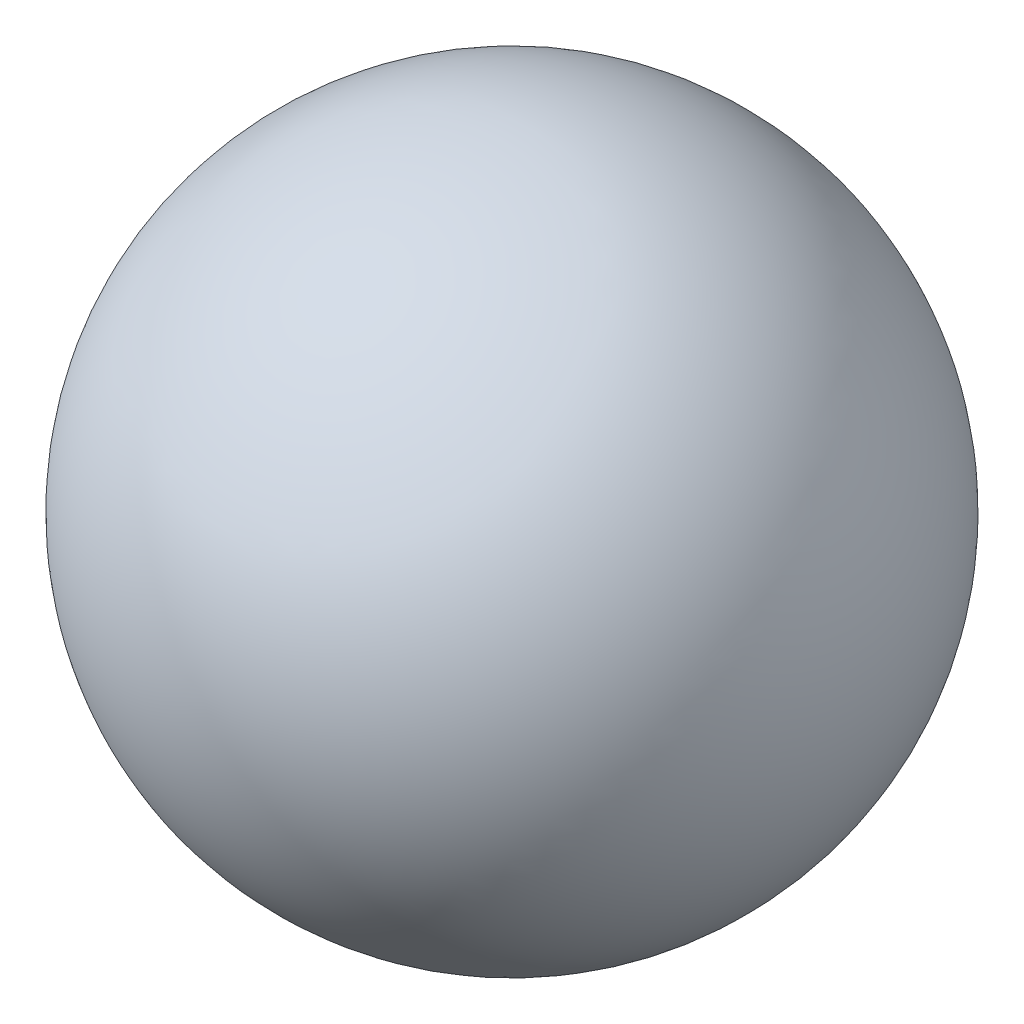
ISO-10303-21;
HEADER;
FILE_DESCRIPTION(('STEP AP214'),'2;1');
FILE_NAME('part.step','',(''),(''),'','','');
FILE_SCHEMA(('AUTOMOTIVE_DESIGN { 1 0 10303 214 1 1 1 1 }'));
ENDSEC;
DATA;
#1=APPLICATION_CONTEXT('core data for automotive mechanical design processes');
#2=APPLICATION_PROTOCOL_DEFINITION('international standard','automotive_design',2000,#1);
#3=PRODUCT_CONTEXT('',#1,'mechanical');
#4=PRODUCT('Part','Part','',(#3));
#5=PRODUCT_RELATED_PRODUCT_CATEGORY('part','',(#4));
#6=PRODUCT_DEFINITION_FORMATION('','',#4);
#7=PRODUCT_DEFINITION_CONTEXT('part definition',#1,'design');
#8=PRODUCT_DEFINITION('design','',#6,#7);
#9=PRODUCT_DEFINITION_SHAPE('','',#8);
#10=(LENGTH_UNIT() NAMED_UNIT(*) SI_UNIT(.MILLI.,.METRE.));
#11=(NAMED_UNIT(*) PLANE_ANGLE_UNIT() SI_UNIT($,.RADIAN.));
#12=(NAMED_UNIT(*) SI_UNIT($,.STERADIAN.) SOLID_ANGLE_UNIT());
#13=UNCERTAINTY_MEASURE_WITH_UNIT(LENGTH_MEASURE(1.E-05),#10,'distance_accuracy_value','');
#14=(GEOMETRIC_REPRESENTATION_CONTEXT(3) GLOBAL_UNCERTAINTY_ASSIGNED_CONTEXT((#13)) GLOBAL_UNIT_ASSIGNED_CONTEXT((#10,
#11,#12)) REPRESENTATION_CONTEXT('',''));
#15=CARTESIAN_POINT('',(0.,0.,0.));
#16=DIRECTION('',(0.,0.,1.));
#17=DIRECTION('',(1.,0.,0.));
#18=AXIS2_PLACEMENT_3D('',#15,#16,#17);
#19=CARTESIAN_POINT('',(0.,0.,0.));
#20=DIRECTION('',(0.,0.,-1.));
#21=DIRECTION('',(1.,0.,0.));
#22=AXIS2_PLACEMENT_3D('',#19,#20,#21);
#23=SPHERICAL_SURFACE('',#22,3.81);
#24=CARTESIAN_POINT('',(0.,0.,-3.81));
#25=VERTEX_POINT('',#24);
#26=VERTEX_LOOP('',#25);
#27=FACE_BOUND('',#26,.T.);
#28=ADVANCED_FACE('F41',(#27),#23,.T.);
#29=CLOSED_SHELL('',(#28));
#30=MANIFOLD_SOLID_BREP('B2',#29);
#31=ADVANCED_BREP_SHAPE_REPRESENTATION('',(#18,#30),#14);
#32=SHAPE_DEFINITION_REPRESENTATION(#9,#31);
ENDSEC;
END-ISO-10303-21;
